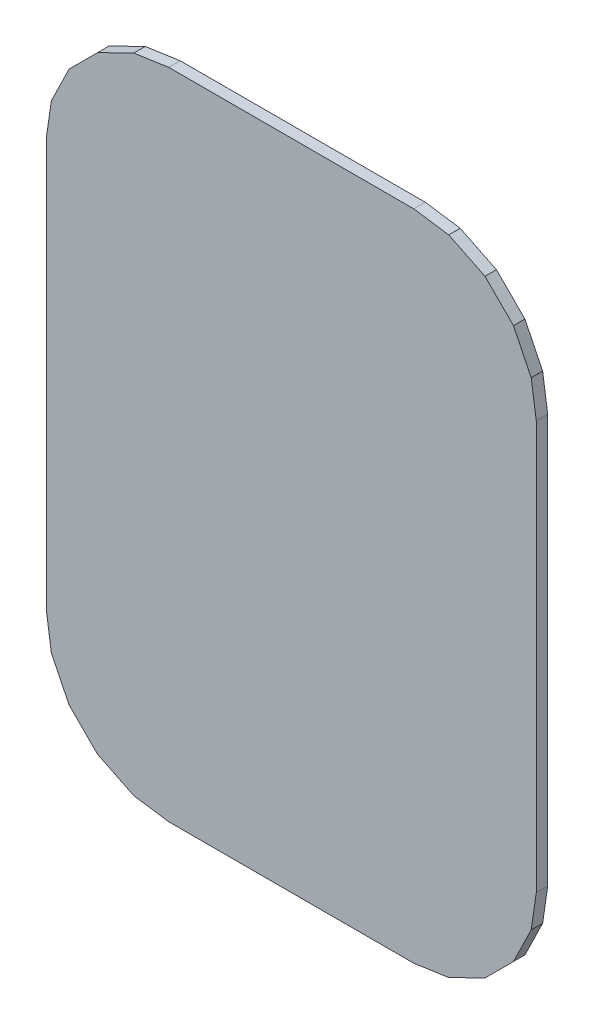
ISO-10303-21;
HEADER;
FILE_DESCRIPTION(('STEP AP214'),'2;1');
FILE_NAME('part.step','',(''),(''),'','','');
FILE_SCHEMA(('AUTOMOTIVE_DESIGN { 1 0 10303 214 1 1 1 1 }'));
ENDSEC;
DATA;
#1=APPLICATION_CONTEXT('core data for automotive mechanical design processes');
#2=APPLICATION_PROTOCOL_DEFINITION('international standard','automotive_design',2000,#1);
#3=PRODUCT_CONTEXT('',#1,'mechanical');
#4=PRODUCT('Part','Part','',(#3));
#5=PRODUCT_RELATED_PRODUCT_CATEGORY('part','',(#4));
#6=PRODUCT_DEFINITION_FORMATION('','',#4);
#7=PRODUCT_DEFINITION_CONTEXT('part definition',#1,'design');
#8=PRODUCT_DEFINITION('design','',#6,#7);
#9=PRODUCT_DEFINITION_SHAPE('','',#8);
#10=(LENGTH_UNIT() NAMED_UNIT(*) SI_UNIT(.MILLI.,.METRE.));
#11=(NAMED_UNIT(*) PLANE_ANGLE_UNIT() SI_UNIT($,.RADIAN.));
#12=(NAMED_UNIT(*) SI_UNIT($,.STERADIAN.) SOLID_ANGLE_UNIT());
#13=UNCERTAINTY_MEASURE_WITH_UNIT(LENGTH_MEASURE(1.E-05),#10,'distance_accuracy_value','');
#14=(GEOMETRIC_REPRESENTATION_CONTEXT(3) GLOBAL_UNCERTAINTY_ASSIGNED_CONTEXT((#13)) GLOBAL_UNIT_ASSIGNED_CONTEXT((#10,
#11,#12)) REPRESENTATION_CONTEXT('',''));
#15=CARTESIAN_POINT('',(0.,0.,0.));
#16=DIRECTION('',(0.,0.,1.));
#17=DIRECTION('',(1.,0.,0.));
#18=AXIS2_PLACEMENT_3D('',#15,#16,#17);
#19=CARTESIAN_POINT('',(109.1,-68.099999,1.635));
#20=DIRECTION('',(0.,0.,-1.));
#21=DIRECTION('',(0.,-1.,0.));
#22=AXIS2_PLACEMENT_3D('',#19,#20,#21);
#23=PLANE('',#22);
#24=DIRECTION('',(0.98955187352313,-0.144177285336019,0.));
#25=VECTOR('',#24,1.);
#26=CARTESIAN_POINT('',(109.475,-67.099999,1.635));
#27=LINE('',#26,#25);
#28=CARTESIAN_POINT('',(109.475,-67.099999,1.635));
#29=VERTEX_POINT('',#28);
#30=CARTESIAN_POINT('',(109.582001,-67.115589,1.635));
#31=VERTEX_POINT('',#30);
#32=EDGE_CURVE('E26',#29,#31,#27,.T.);
#33=ORIENTED_EDGE('',*,*,#32,.F.);
#34=DIRECTION('',(1.,0.,0.));
#35=VECTOR('',#34,1.);
#36=CARTESIAN_POINT('',(108.725,-67.099999,1.635));
#37=LINE('',#36,#35);
#38=CARTESIAN_POINT('',(108.725,-67.099999,1.635));
#39=VERTEX_POINT('',#38);
#40=EDGE_CURVE('E341',#39,#29,#37,.T.);
#41=ORIENTED_EDGE('',*,*,#40,.F.);
#42=DIRECTION('',(0.98955187352313,0.144177285336019,0.));
#43=VECTOR('',#42,1.);
#44=CARTESIAN_POINT('',(108.617999,-67.115589,1.635));
#45=LINE('',#44,#43);
#46=CARTESIAN_POINT('',(108.617999,-67.115589,1.635));
#47=VERTEX_POINT('',#46);
#48=EDGE_CURVE('E365',#47,#39,#45,.T.);
#49=ORIENTED_EDGE('',*,*,#48,.F.);
#50=DIRECTION('',(0.898391534871547,0.439195457707779,0.));
#51=VECTOR('',#50,1.);
#52=CARTESIAN_POINT('',(108.507096,-67.169806,1.635));
#53=LINE('',#52,#51);
#54=CARTESIAN_POINT('',(108.507096,-67.169806,1.635));
#55=VERTEX_POINT('',#54);
#56=EDGE_CURVE('E395',#55,#47,#53,.T.);
#57=ORIENTED_EDGE('',*,*,#56,.F.);
#58=DIRECTION('',(0.707106781186048,0.707106781187048,0.));
#59=VECTOR('',#58,1.);
#60=CARTESIAN_POINT('',(108.419807,-67.257095,1.635));
#61=LINE('',#60,#59);
#62=CARTESIAN_POINT('',(108.419807,-67.257095,1.635));
#63=VERTEX_POINT('',#62);
#64=EDGE_CURVE('E351',#63,#55,#61,.T.);
#65=ORIENTED_EDGE('',*,*,#64,.F.);
#66=DIRECTION('',(0.439195457707779,0.898391534871547,0.));
#67=VECTOR('',#66,1.);
#68=CARTESIAN_POINT('',(108.36559,-67.367998,1.635));
#69=LINE('',#68,#67);
#70=CARTESIAN_POINT('',(108.36559,-67.367998,1.635));
#71=VERTEX_POINT('',#70);
#72=EDGE_CURVE('E409',#71,#63,#69,.T.);
#73=ORIENTED_EDGE('',*,*,#72,.F.);
#74=DIRECTION('',(0.144177285336019,0.98955187352313,0.));
#75=VECTOR('',#74,1.);
#76=CARTESIAN_POINT('',(108.35,-67.474999,1.635));
#77=LINE('',#76,#75);
#78=CARTESIAN_POINT('',(108.35,-67.474999,1.635));
#79=VERTEX_POINT('',#78);
#80=EDGE_CURVE('E378',#79,#71,#77,.T.);
#81=ORIENTED_EDGE('',*,*,#80,.F.);
#82=DIRECTION('',(0.,1.,0.));
#83=VECTOR('',#82,1.);
#84=CARTESIAN_POINT('',(108.35,-68.724999,1.635));
#85=LINE('',#84,#83);
#86=CARTESIAN_POINT('',(108.35,-68.724999,1.635));
#87=VERTEX_POINT('',#86);
#88=EDGE_CURVE('E309',#87,#79,#85,.T.);
#89=ORIENTED_EDGE('',*,*,#88,.F.);
#90=DIRECTION('',(-0.144177285336019,0.98955187352313,0.));
#91=VECTOR('',#90,1.);
#92=CARTESIAN_POINT('',(108.36559,-68.832,1.635));
#93=LINE('',#92,#91);
#94=CARTESIAN_POINT('',(108.36559,-68.832,1.635));
#95=VERTEX_POINT('',#94);
#96=EDGE_CURVE('E404',#95,#87,#93,.T.);
#97=ORIENTED_EDGE('',*,*,#96,.F.);
#98=DIRECTION('',(-0.439195457707779,0.898391534871547,0.));
#99=VECTOR('',#98,1.);
#100=CARTESIAN_POINT('',(108.419807,-68.942903,1.635));
#101=LINE('',#100,#99);
#102=CARTESIAN_POINT('',(108.419807,-68.942903,1.635));
#103=VERTEX_POINT('',#102);
#104=EDGE_CURVE('E386',#103,#95,#101,.T.);
#105=ORIENTED_EDGE('',*,*,#104,.F.);
#106=DIRECTION('',(-0.707106781186548,0.707106781186548,0.));
#107=VECTOR('',#106,1.);
#108=CARTESIAN_POINT('',(108.507096,-69.030192,1.635));
#109=LINE('',#108,#107);
#110=CARTESIAN_POINT('',(108.507096,-69.030192,1.635));
#111=VERTEX_POINT('',#110);
#112=EDGE_CURVE('E301',#111,#103,#109,.T.);
#113=ORIENTED_EDGE('',*,*,#112,.F.);
#114=DIRECTION('',(-0.898391534871547,0.439195457707779,0.));
#115=VECTOR('',#114,1.);
#116=CARTESIAN_POINT('',(108.617999,-69.084409,1.635));
#117=LINE('',#116,#115);
#118=CARTESIAN_POINT('',(108.617999,-69.084409,1.635));
#119=VERTEX_POINT('',#118);
#120=EDGE_CURVE('E361',#119,#111,#117,.T.);
#121=ORIENTED_EDGE('',*,*,#120,.F.);
#122=DIRECTION('',(-0.98955187352313,0.144177285336019,0.));
#123=VECTOR('',#122,1.);
#124=CARTESIAN_POINT('',(108.725,-69.099999,1.635));
#125=LINE('',#124,#123);
#126=CARTESIAN_POINT('',(108.725,-69.099999,1.635));
#127=VERTEX_POINT('',#126);
#128=EDGE_CURVE('E340',#127,#119,#125,.T.);
#129=ORIENTED_EDGE('',*,*,#128,.F.);
#130=DIRECTION('',(-1.,0.,0.));
#131=VECTOR('',#130,1.);
#132=CARTESIAN_POINT('',(109.475,-69.099999,1.635));
#133=LINE('',#132,#131);
#134=CARTESIAN_POINT('',(109.475,-69.099999,1.635));
#135=VERTEX_POINT('',#134);
#136=EDGE_CURVE('E276',#135,#127,#133,.T.);
#137=ORIENTED_EDGE('',*,*,#136,.F.);
#138=DIRECTION('',(-0.98955187352313,-0.144177285336019,0.));
#139=VECTOR('',#138,1.);
#140=CARTESIAN_POINT('',(109.582001,-69.084409,1.635));
#141=LINE('',#140,#139);
#142=CARTESIAN_POINT('',(109.582001,-69.084409,1.635));
#143=VERTEX_POINT('',#142);
#144=EDGE_CURVE('E318',#143,#135,#141,.T.);
#145=ORIENTED_EDGE('',*,*,#144,.F.);
#146=DIRECTION('',(-0.898391534871547,-0.439195457707779,0.));
#147=VECTOR('',#146,1.);
#148=CARTESIAN_POINT('',(109.692904,-69.030192,1.635));
#149=LINE('',#148,#147);
#150=CARTESIAN_POINT('',(109.692904,-69.030192,1.635));
#151=VERTEX_POINT('',#150);
#152=EDGE_CURVE('E308',#151,#143,#149,.T.);
#153=ORIENTED_EDGE('',*,*,#152,.F.);
#154=DIRECTION('',(-0.707106781186548,-0.707106781186548,0.));
#155=VECTOR('',#154,1.);
#156=CARTESIAN_POINT('',(109.780193,-68.942903,1.635));
#157=LINE('',#156,#155);
#158=CARTESIAN_POINT('',(109.780193,-68.942903,1.635));
#159=VERTEX_POINT('',#158);
#160=EDGE_CURVE('E288',#159,#151,#157,.T.);
#161=ORIENTED_EDGE('',*,*,#160,.F.);
#162=DIRECTION('',(-0.439195457707779,-0.898391534871547,0.));
#163=VECTOR('',#162,1.);
#164=CARTESIAN_POINT('',(109.83441,-68.832,1.635));
#165=LINE('',#164,#163);
#166=CARTESIAN_POINT('',(109.83441,-68.832,1.635));
#167=VERTEX_POINT('',#166);
#168=EDGE_CURVE('E244',#167,#159,#165,.T.);
#169=ORIENTED_EDGE('',*,*,#168,.F.);
#170=DIRECTION('',(-0.144177285336019,-0.98955187352313,0.));
#171=VECTOR('',#170,1.);
#172=CARTESIAN_POINT('',(109.85,-68.724999,1.635));
#173=LINE('',#172,#171);
#174=CARTESIAN_POINT('',(109.85,-68.724999,1.635));
#175=VERTEX_POINT('',#174);
#176=EDGE_CURVE('E256',#175,#167,#173,.T.);
#177=ORIENTED_EDGE('',*,*,#176,.F.);
#178=DIRECTION('',(0.,-1.,0.));
#179=VECTOR('',#178,1.);
#180=CARTESIAN_POINT('',(109.85,-67.474999,1.635));
#181=LINE('',#180,#179);
#182=CARTESIAN_POINT('',(109.85,-67.474999,1.635));
#183=VERTEX_POINT('',#182);
#184=EDGE_CURVE('E259',#183,#175,#181,.T.);
#185=ORIENTED_EDGE('',*,*,#184,.F.);
#186=DIRECTION('',(0.144177285336019,-0.98955187352313,0.));
#187=VECTOR('',#186,1.);
#188=CARTESIAN_POINT('',(109.83441,-67.367998,1.635));
#189=LINE('',#188,#187);
#190=CARTESIAN_POINT('',(109.83441,-67.367998,1.635));
#191=VERTEX_POINT('',#190);
#192=EDGE_CURVE('E533',#191,#183,#189,.T.);
#193=ORIENTED_EDGE('',*,*,#192,.F.);
#194=DIRECTION('',(0.439195457707779,-0.898391534871547,0.));
#195=VECTOR('',#194,1.);
#196=CARTESIAN_POINT('',(109.780193,-67.257095,1.635));
#197=LINE('',#196,#195);
#198=CARTESIAN_POINT('',(109.780193,-67.257095,1.635));
#199=VERTEX_POINT('',#198);
#200=EDGE_CURVE('E520',#199,#191,#197,.T.);
#201=ORIENTED_EDGE('',*,*,#200,.F.);
#202=DIRECTION('',(0.707106781186048,-0.707106781187048,0.));
#203=VECTOR('',#202,1.);
#204=CARTESIAN_POINT('',(109.692904,-67.169806,1.635));
#205=LINE('',#204,#203);
#206=CARTESIAN_POINT('',(109.692904,-67.169806,1.635));
#207=VERTEX_POINT('',#206);
#208=EDGE_CURVE('E951',#207,#199,#205,.T.);
#209=ORIENTED_EDGE('',*,*,#208,.F.);
#210=DIRECTION('',(0.898391534871547,-0.439195457707779,0.));
#211=VECTOR('',#210,1.);
#212=CARTESIAN_POINT('',(109.582001,-67.115589,1.635));
#213=LINE('',#212,#211);
#214=EDGE_CURVE('E954',#31,#207,#213,.T.);
#215=ORIENTED_EDGE('',*,*,#214,.F.);
#216=EDGE_LOOP('',(#33,#41,#49,#57,#65,#73,#81,#89,#97,#105,#113,#121,#129,#137,#145,#153,#161,
#169,#177,#185,#193,#201,#209,#215));
#217=FACE_BOUND('',#216,.T.);
#218=ADVANCED_FACE('F17',(#217),#23,.F.);
#219=CARTESIAN_POINT('',(109.1,-68.099999,1.6));
#220=DIRECTION('',(0.,0.,-1.));
#221=DIRECTION('',(0.,-1.,0.));
#222=AXIS2_PLACEMENT_3D('',#219,#220,#221);
#223=PLANE('',#222);
#224=DIRECTION('',(0.898391534871547,-0.439195457707779,0.));
#225=VECTOR('',#224,1.);
#226=CARTESIAN_POINT('',(109.582001,-67.115589,1.6));
#227=LINE('',#226,#225);
#228=CARTESIAN_POINT('',(109.582001,-67.115589,1.6));
#229=VERTEX_POINT('',#228);
#230=CARTESIAN_POINT('',(109.692904,-67.169806,1.6));
#231=VERTEX_POINT('',#230);
#232=EDGE_CURVE('E957',#229,#231,#227,.T.);
#233=ORIENTED_EDGE('',*,*,#232,.T.);
#234=DIRECTION('',(0.707106781186048,-0.707106781187048,0.));
#235=VECTOR('',#234,1.);
#236=CARTESIAN_POINT('',(109.692904,-67.169806,1.6));
#237=LINE('',#236,#235);
#238=CARTESIAN_POINT('',(109.780193,-67.257095,1.6));
#239=VERTEX_POINT('',#238);
#240=EDGE_CURVE('E518',#231,#239,#237,.T.);
#241=ORIENTED_EDGE('',*,*,#240,.T.);
#242=DIRECTION('',(0.439195457707779,-0.898391534871547,0.));
#243=VECTOR('',#242,1.);
#244=CARTESIAN_POINT('',(109.780193,-67.257095,1.6));
#245=LINE('',#244,#243);
#246=CARTESIAN_POINT('',(109.83441,-67.367998,1.6));
#247=VERTEX_POINT('',#246);
#248=EDGE_CURVE('E530',#239,#247,#245,.T.);
#249=ORIENTED_EDGE('',*,*,#248,.T.);
#250=DIRECTION('',(0.144177285336019,-0.98955187352313,0.));
#251=VECTOR('',#250,1.);
#252=CARTESIAN_POINT('',(109.83441,-67.367998,1.6));
#253=LINE('',#252,#251);
#254=CARTESIAN_POINT('',(109.85,-67.474999,1.6));
#255=VERTEX_POINT('',#254);
#256=EDGE_CURVE('E251',#247,#255,#253,.T.);
#257=ORIENTED_EDGE('',*,*,#256,.T.);
#258=DIRECTION('',(0.,-1.,0.));
#259=VECTOR('',#258,1.);
#260=CARTESIAN_POINT('',(109.85,-67.474999,1.6));
#261=LINE('',#260,#259);
#262=CARTESIAN_POINT('',(109.85,-68.724999,1.6));
#263=VERTEX_POINT('',#262);
#264=EDGE_CURVE('E247',#255,#263,#261,.T.);
#265=ORIENTED_EDGE('',*,*,#264,.T.);
#266=DIRECTION('',(-0.144177285336019,-0.98955187352313,0.));
#267=VECTOR('',#266,1.);
#268=CARTESIAN_POINT('',(109.85,-68.724999,1.6));
#269=LINE('',#268,#267);
#270=CARTESIAN_POINT('',(109.83441,-68.832,1.6));
#271=VERTEX_POINT('',#270);
#272=EDGE_CURVE('E232',#263,#271,#269,.T.);
#273=ORIENTED_EDGE('',*,*,#272,.T.);
#274=DIRECTION('',(-0.439195457707779,-0.898391534871547,0.));
#275=VECTOR('',#274,1.);
#276=CARTESIAN_POINT('',(109.83441,-68.832,1.6));
#277=LINE('',#276,#275);
#278=CARTESIAN_POINT('',(109.780193,-68.942903,1.6));
#279=VERTEX_POINT('',#278);
#280=EDGE_CURVE('E285',#271,#279,#277,.T.);
#281=ORIENTED_EDGE('',*,*,#280,.T.);
#282=DIRECTION('',(-0.707106781186548,-0.707106781186548,0.));
#283=VECTOR('',#282,1.);
#284=CARTESIAN_POINT('',(109.780193,-68.942903,1.6));
#285=LINE('',#284,#283);
#286=CARTESIAN_POINT('',(109.692904,-69.030192,1.6));
#287=VERTEX_POINT('',#286);
#288=EDGE_CURVE('E296',#279,#287,#285,.T.);
#289=ORIENTED_EDGE('',*,*,#288,.T.);
#290=DIRECTION('',(-0.898391534871547,-0.439195457707779,0.));
#291=VECTOR('',#290,1.);
#292=CARTESIAN_POINT('',(109.692904,-69.030192,1.6));
#293=LINE('',#292,#291);
#294=CARTESIAN_POINT('',(109.582001,-69.084409,1.6));
#295=VERTEX_POINT('',#294);
#296=EDGE_CURVE('E307',#287,#295,#293,.T.);
#297=ORIENTED_EDGE('',*,*,#296,.T.);
#298=DIRECTION('',(-0.98955187352313,-0.144177285336019,0.));
#299=VECTOR('',#298,1.);
#300=CARTESIAN_POINT('',(109.582001,-69.084409,1.6));
#301=LINE('',#300,#299);
#302=CARTESIAN_POINT('',(109.475,-69.099999,1.6));
#303=VERTEX_POINT('',#302);
#304=EDGE_CURVE('E281',#295,#303,#301,.T.);
#305=ORIENTED_EDGE('',*,*,#304,.T.);
#306=DIRECTION('',(-1.,0.,0.));
#307=VECTOR('',#306,1.);
#308=CARTESIAN_POINT('',(109.475,-69.099999,1.6));
#309=LINE('',#308,#307);
#310=CARTESIAN_POINT('',(108.725,-69.099999,1.6));
#311=VERTEX_POINT('',#310);
#312=EDGE_CURVE('E336',#303,#311,#309,.T.);
#313=ORIENTED_EDGE('',*,*,#312,.T.);
#314=DIRECTION('',(-0.98955187352313,0.144177285336019,0.));
#315=VECTOR('',#314,1.);
#316=CARTESIAN_POINT('',(108.725,-69.099999,1.6));
#317=LINE('',#316,#315);
#318=CARTESIAN_POINT('',(108.617999,-69.084409,1.6));
#319=VERTEX_POINT('',#318);
#320=EDGE_CURVE('E360',#311,#319,#317,.T.);
#321=ORIENTED_EDGE('',*,*,#320,.T.);
#322=DIRECTION('',(-0.898391534871547,0.439195457707779,0.));
#323=VECTOR('',#322,1.);
#324=CARTESIAN_POINT('',(108.617999,-69.084409,1.6));
#325=LINE('',#324,#323);
#326=CARTESIAN_POINT('',(108.507096,-69.030192,1.6));
#327=VERTEX_POINT('',#326);
#328=EDGE_CURVE('E297',#319,#327,#325,.T.);
#329=ORIENTED_EDGE('',*,*,#328,.T.);
#330=DIRECTION('',(-0.707106781186548,0.707106781186548,0.));
#331=VECTOR('',#330,1.);
#332=CARTESIAN_POINT('',(108.507096,-69.030192,1.6));
#333=LINE('',#332,#331);
#334=CARTESIAN_POINT('',(108.419807,-68.942903,1.6));
#335=VERTEX_POINT('',#334);
#336=EDGE_CURVE('E269',#327,#335,#333,.T.);
#337=ORIENTED_EDGE('',*,*,#336,.T.);
#338=DIRECTION('',(-0.439195457707779,0.898391534871547,0.));
#339=VECTOR('',#338,1.);
#340=CARTESIAN_POINT('',(108.419807,-68.942903,1.6));
#341=LINE('',#340,#339);
#342=CARTESIAN_POINT('',(108.36559,-68.832,1.6));
#343=VERTEX_POINT('',#342);
#344=EDGE_CURVE('E394',#335,#343,#341,.T.);
#345=ORIENTED_EDGE('',*,*,#344,.T.);
#346=DIRECTION('',(-0.144177285336019,0.98955187352313,0.));
#347=VECTOR('',#346,1.);
#348=CARTESIAN_POINT('',(108.36559,-68.832,1.6));
#349=LINE('',#348,#347);
#350=CARTESIAN_POINT('',(108.35,-68.724999,1.6));
#351=VERTEX_POINT('',#350);
#352=EDGE_CURVE('E314',#343,#351,#349,.T.);
#353=ORIENTED_EDGE('',*,*,#352,.T.);
#354=DIRECTION('',(0.,1.,0.));
#355=VECTOR('',#354,1.);
#356=CARTESIAN_POINT('',(108.35,-68.724999,1.6));
#357=LINE('',#356,#355);
#358=CARTESIAN_POINT('',(108.35,-67.474999,1.6));
#359=VERTEX_POINT('',#358);
#360=EDGE_CURVE('E326',#351,#359,#357,.T.);
#361=ORIENTED_EDGE('',*,*,#360,.T.);
#362=DIRECTION('',(0.144177285336019,0.98955187352313,0.));
#363=VECTOR('',#362,1.);
#364=CARTESIAN_POINT('',(108.35,-67.474999,1.6));
#365=LINE('',#364,#363);
#366=CARTESIAN_POINT('',(108.36559,-67.367998,1.6));
#367=VERTEX_POINT('',#366);
#368=EDGE_CURVE('E414',#359,#367,#365,.T.);
#369=ORIENTED_EDGE('',*,*,#368,.T.);
#370=DIRECTION('',(0.439195457707779,0.898391534871547,0.));
#371=VECTOR('',#370,1.);
#372=CARTESIAN_POINT('',(108.36559,-67.367998,1.6));
#373=LINE('',#372,#371);
#374=CARTESIAN_POINT('',(108.419807,-67.257095,1.6));
#375=VERTEX_POINT('',#374);
#376=EDGE_CURVE('E356',#367,#375,#373,.T.);
#377=ORIENTED_EDGE('',*,*,#376,.T.);
#378=DIRECTION('',(0.707106781186048,0.707106781187048,0.));
#379=VECTOR('',#378,1.);
#380=CARTESIAN_POINT('',(108.419807,-67.257095,1.6));
#381=LINE('',#380,#379);
#382=CARTESIAN_POINT('',(108.507096,-67.169806,1.6));
#383=VERTEX_POINT('',#382);
#384=EDGE_CURVE('E400',#375,#383,#381,.T.);
#385=ORIENTED_EDGE('',*,*,#384,.T.);
#386=DIRECTION('',(0.898391534871547,0.439195457707779,0.));
#387=VECTOR('',#386,1.);
#388=CARTESIAN_POINT('',(108.507096,-67.169806,1.6));
#389=LINE('',#388,#387);
#390=CARTESIAN_POINT('',(108.617999,-67.115589,1.6));
#391=VERTEX_POINT('',#390);
#392=EDGE_CURVE('E370',#383,#391,#389,.T.);
#393=ORIENTED_EDGE('',*,*,#392,.T.);
#394=DIRECTION('',(0.98955187352313,0.144177285336019,0.));
#395=VECTOR('',#394,1.);
#396=CARTESIAN_POINT('',(108.617999,-67.115589,1.6));
#397=LINE('',#396,#395);
#398=CARTESIAN_POINT('',(108.725,-67.099999,1.6));
#399=VERTEX_POINT('',#398);
#400=EDGE_CURVE('E346',#391,#399,#397,.T.);
#401=ORIENTED_EDGE('',*,*,#400,.T.);
#402=DIRECTION('',(1.,0.,0.));
#403=VECTOR('',#402,1.);
#404=CARTESIAN_POINT('',(108.725,-67.099999,1.6));
#405=LINE('',#404,#403);
#406=CARTESIAN_POINT('',(109.475,-67.099999,1.6));
#407=VERTEX_POINT('',#406);
#408=EDGE_CURVE('E20',#399,#407,#405,.T.);
#409=ORIENTED_EDGE('',*,*,#408,.T.);
#410=DIRECTION('',(0.98955187352313,-0.144177285336019,0.));
#411=VECTOR('',#410,1.);
#412=CARTESIAN_POINT('',(109.475,-67.099999,1.6));
#413=LINE('',#412,#411);
#414=EDGE_CURVE('E11',#407,#229,#413,.T.);
#415=ORIENTED_EDGE('',*,*,#414,.T.);
#416=EDGE_LOOP('',(#233,#241,#249,#257,#265,#273,#281,#289,#297,#305,#313,#321,#329,#337,#345,
#353,#361,#369,#377,#385,#393,#401,#409,#415));
#417=FACE_BOUND('',#416,.T.);
#418=ADVANCED_FACE('F249',(#417),#223,.T.);
#419=CARTESIAN_POINT('',(109.475,-67.099999,1.6));
#420=DIRECTION('',(0.144177285336019,0.98955187352313,0.));
#421=DIRECTION('',(0.,0.,-1.));
#422=AXIS2_PLACEMENT_3D('',#419,#420,#421);
#423=PLANE('',#422);
#424=DIRECTION('',(0.,0.,1.));
#425=VECTOR('',#424,1.);
#426=CARTESIAN_POINT('',(109.475,-67.099999,1.6));
#427=LINE('',#426,#425);
#428=EDGE_CURVE('E345',#407,#29,#427,.T.);
#429=ORIENTED_EDGE('',*,*,#428,.T.);
#430=ORIENTED_EDGE('',*,*,#32,.T.);
#431=DIRECTION('',(0.,0.,1.));
#432=VECTOR('',#431,1.);
#433=CARTESIAN_POINT('',(109.582001,-67.115589,1.6));
#434=LINE('',#433,#432);
#435=EDGE_CURVE('E963',#229,#31,#434,.T.);
#436=ORIENTED_EDGE('',*,*,#435,.F.);
#437=ORIENTED_EDGE('',*,*,#414,.F.);
#438=EDGE_LOOP('',(#429,#430,#436,#437));
#439=FACE_BOUND('',#438,.T.);
#440=ADVANCED_FACE('F862',(#439),#423,.T.);
#441=CARTESIAN_POINT('',(108.725,-67.099999,1.6));
#442=DIRECTION('',(0.,1.,0.));
#443=DIRECTION('',(1.,0.,0.));
#444=AXIS2_PLACEMENT_3D('',#441,#442,#443);
#445=PLANE('',#444);
#446=DIRECTION('',(0.,0.,1.));
#447=VECTOR('',#446,1.);
#448=CARTESIAN_POINT('',(108.725,-67.099999,1.6));
#449=LINE('',#448,#447);
#450=EDGE_CURVE('E369',#399,#39,#449,.T.);
#451=ORIENTED_EDGE('',*,*,#450,.T.);
#452=ORIENTED_EDGE('',*,*,#40,.T.);
#453=ORIENTED_EDGE('',*,*,#428,.F.);
#454=ORIENTED_EDGE('',*,*,#408,.F.);
#455=EDGE_LOOP('',(#451,#452,#453,#454));
#456=FACE_BOUND('',#455,.T.);
#457=ADVANCED_FACE('F459',(#456),#445,.T.);
#458=CARTESIAN_POINT('',(108.617999,-67.115589,1.6));
#459=DIRECTION('',(-0.144177285336019,0.98955187352313,0.));
#460=DIRECTION('',(0.,0.,1.));
#461=AXIS2_PLACEMENT_3D('',#458,#459,#460);
#462=PLANE('',#461);
#463=DIRECTION('',(0.,0.,1.));
#464=VECTOR('',#463,1.);
#465=CARTESIAN_POINT('',(108.617999,-67.115589,1.6));
#466=LINE('',#465,#464);
#467=EDGE_CURVE('E399',#391,#47,#466,.T.);
#468=ORIENTED_EDGE('',*,*,#467,.T.);
#469=ORIENTED_EDGE('',*,*,#48,.T.);
#470=ORIENTED_EDGE('',*,*,#450,.F.);
#471=ORIENTED_EDGE('',*,*,#400,.F.);
#472=EDGE_LOOP('',(#468,#469,#470,#471));
#473=FACE_BOUND('',#472,.T.);
#474=ADVANCED_FACE('F462',(#473),#462,.T.);
#475=CARTESIAN_POINT('',(108.507096,-67.169806,1.6));
#476=DIRECTION('',(-0.439195457707779,0.898391534871547,0.));
#477=DIRECTION('',(0.,0.,1.));
#478=AXIS2_PLACEMENT_3D('',#475,#476,#477);
#479=PLANE('',#478);
#480=DIRECTION('',(0.,0.,1.));
#481=VECTOR('',#480,1.);
#482=CARTESIAN_POINT('',(108.507096,-67.169806,1.6));
#483=LINE('',#482,#481);
#484=EDGE_CURVE('E355',#383,#55,#483,.T.);
#485=ORIENTED_EDGE('',*,*,#484,.T.);
#486=ORIENTED_EDGE('',*,*,#56,.T.);
#487=ORIENTED_EDGE('',*,*,#467,.F.);
#488=ORIENTED_EDGE('',*,*,#392,.F.);
#489=EDGE_LOOP('',(#485,#486,#487,#488));
#490=FACE_BOUND('',#489,.T.);
#491=ADVANCED_FACE('F464',(#490),#479,.T.);
#492=CARTESIAN_POINT('',(108.419807,-67.257095,1.6));
#493=DIRECTION('',(-0.707106781187048,0.707106781186048,0.));
#494=DIRECTION('',(0.,0.,1.));
#495=AXIS2_PLACEMENT_3D('',#492,#493,#494);
#496=PLANE('',#495);
#497=DIRECTION('',(0.,0.,1.));
#498=VECTOR('',#497,1.);
#499=CARTESIAN_POINT('',(108.419807,-67.257095,1.6));
#500=LINE('',#499,#498);
#501=EDGE_CURVE('E413',#375,#63,#500,.T.);
#502=ORIENTED_EDGE('',*,*,#501,.T.);
#503=ORIENTED_EDGE('',*,*,#64,.T.);
#504=ORIENTED_EDGE('',*,*,#484,.F.);
#505=ORIENTED_EDGE('',*,*,#384,.F.);
#506=EDGE_LOOP('',(#502,#503,#504,#505));
#507=FACE_BOUND('',#506,.T.);
#508=ADVANCED_FACE('F467',(#507),#496,.T.);
#509=CARTESIAN_POINT('',(108.36559,-67.367998,1.6));
#510=DIRECTION('',(-0.898391534871547,0.439195457707779,0.));
#511=DIRECTION('',(0.,0.,1.));
#512=AXIS2_PLACEMENT_3D('',#509,#510,#511);
#513=PLANE('',#512);
#514=DIRECTION('',(0.,0.,1.));
#515=VECTOR('',#514,1.);
#516=CARTESIAN_POINT('',(108.36559,-67.367998,1.6));
#517=LINE('',#516,#515);
#518=EDGE_CURVE('E382',#367,#71,#517,.T.);
#519=ORIENTED_EDGE('',*,*,#518,.T.);
#520=ORIENTED_EDGE('',*,*,#72,.T.);
#521=ORIENTED_EDGE('',*,*,#501,.F.);
#522=ORIENTED_EDGE('',*,*,#376,.F.);
#523=EDGE_LOOP('',(#519,#520,#521,#522));
#524=FACE_BOUND('',#523,.T.);
#525=ADVANCED_FACE('F471',(#524),#513,.T.);
#526=CARTESIAN_POINT('',(108.35,-67.474999,1.6));
#527=DIRECTION('',(-0.98955187352313,0.144177285336019,0.));
#528=DIRECTION('',(0.,0.,1.));
#529=AXIS2_PLACEMENT_3D('',#526,#527,#528);
#530=PLANE('',#529);
#531=DIRECTION('',(0.,0.,1.));
#532=VECTOR('',#531,1.);
#533=CARTESIAN_POINT('',(108.35,-67.474999,1.6));
#534=LINE('',#533,#532);
#535=EDGE_CURVE('E313',#359,#79,#534,.T.);
#536=ORIENTED_EDGE('',*,*,#535,.T.);
#537=ORIENTED_EDGE('',*,*,#80,.T.);
#538=ORIENTED_EDGE('',*,*,#518,.F.);
#539=ORIENTED_EDGE('',*,*,#368,.F.);
#540=EDGE_LOOP('',(#536,#537,#538,#539));
#541=FACE_BOUND('',#540,.T.);
#542=ADVANCED_FACE('F474',(#541),#530,.T.);
#543=CARTESIAN_POINT('',(108.35,-68.724999,1.6));
#544=DIRECTION('',(-1.,0.,0.));
#545=DIRECTION('',(0.,0.,1.));
#546=AXIS2_PLACEMENT_3D('',#543,#544,#545);
#547=PLANE('',#546);
#548=DIRECTION('',(0.,0.,1.));
#549=VECTOR('',#548,1.);
#550=CARTESIAN_POINT('',(108.35,-68.724999,1.6));
#551=LINE('',#550,#549);
#552=EDGE_CURVE('E405',#351,#87,#551,.T.);
#553=ORIENTED_EDGE('',*,*,#552,.T.);
#554=ORIENTED_EDGE('',*,*,#88,.T.);
#555=ORIENTED_EDGE('',*,*,#535,.F.);
#556=ORIENTED_EDGE('',*,*,#360,.F.);
#557=EDGE_LOOP('',(#553,#554,#555,#556));
#558=FACE_BOUND('',#557,.T.);
#559=ADVANCED_FACE('F477',(#558),#547,.T.);
#560=CARTESIAN_POINT('',(108.36559,-68.832,1.6));
#561=DIRECTION('',(-0.98955187352313,-0.144177285336019,0.));
#562=DIRECTION('',(-0.144177285336019,0.98955187352313,0.));
#563=AXIS2_PLACEMENT_3D('',#560,#561,#562);
#564=PLANE('',#563);
#565=DIRECTION('',(0.,0.,1.));
#566=VECTOR('',#565,1.);
#567=CARTESIAN_POINT('',(108.36559,-68.832,1.6));
#568=LINE('',#567,#566);
#569=EDGE_CURVE('E390',#343,#95,#568,.T.);
#570=ORIENTED_EDGE('',*,*,#569,.T.);
#571=ORIENTED_EDGE('',*,*,#96,.T.);
#572=ORIENTED_EDGE('',*,*,#552,.F.);
#573=ORIENTED_EDGE('',*,*,#352,.F.);
#574=EDGE_LOOP('',(#570,#571,#572,#573));
#575=FACE_BOUND('',#574,.T.);
#576=ADVANCED_FACE('F484',(#575),#564,.T.);
#577=CARTESIAN_POINT('',(108.419807,-68.942903,1.6));
#578=DIRECTION('',(-0.898391534871547,-0.439195457707779,0.));
#579=DIRECTION('',(-0.439195457707779,0.898391534871547,0.));
#580=AXIS2_PLACEMENT_3D('',#577,#578,#579);
#581=PLANE('',#580);
#582=DIRECTION('',(0.,0.,1.));
#583=VECTOR('',#582,1.);
#584=CARTESIAN_POINT('',(108.419807,-68.942903,1.6));
#585=LINE('',#584,#583);
#586=EDGE_CURVE('E377',#335,#103,#585,.T.);
#587=ORIENTED_EDGE('',*,*,#586,.T.);
#588=ORIENTED_EDGE('',*,*,#104,.T.);
#589=ORIENTED_EDGE('',*,*,#569,.F.);
#590=ORIENTED_EDGE('',*,*,#344,.F.);
#591=EDGE_LOOP('',(#587,#588,#589,#590));
#592=FACE_BOUND('',#591,.T.);
#593=ADVANCED_FACE('F486',(#592),#581,.T.);
#594=CARTESIAN_POINT('',(108.507096,-69.030192,1.6));
#595=DIRECTION('',(-0.707106781186548,-0.707106781186548,0.));
#596=DIRECTION('',(-0.707106781186548,0.707106781186548,0.));
#597=AXIS2_PLACEMENT_3D('',#594,#595,#596);
#598=PLANE('',#597);
#599=DIRECTION('',(0.,0.,1.));
#600=VECTOR('',#599,1.);
#601=CARTESIAN_POINT('',(108.507096,-69.030192,1.6));
#602=LINE('',#601,#600);
#603=EDGE_CURVE('E302',#327,#111,#602,.T.);
#604=ORIENTED_EDGE('',*,*,#603,.T.);
#605=ORIENTED_EDGE('',*,*,#112,.T.);
#606=ORIENTED_EDGE('',*,*,#586,.F.);
#607=ORIENTED_EDGE('',*,*,#336,.F.);
#608=EDGE_LOOP('',(#604,#605,#606,#607));
#609=FACE_BOUND('',#608,.T.);
#610=ADVANCED_FACE('F490',(#609),#598,.T.);
#611=CARTESIAN_POINT('',(108.617999,-69.084409,1.6));
#612=DIRECTION('',(-0.439195457707779,-0.898391534871547,0.));
#613=DIRECTION('',(-0.898391534871547,0.439195457707779,0.));
#614=AXIS2_PLACEMENT_3D('',#611,#612,#613);
#615=PLANE('',#614);
#616=DIRECTION('',(0.,0.,1.));
#617=VECTOR('',#616,1.);
#618=CARTESIAN_POINT('',(108.617999,-69.084409,1.6));
#619=LINE('',#618,#617);
#620=EDGE_CURVE('E350',#319,#119,#619,.T.);
#621=ORIENTED_EDGE('',*,*,#620,.T.);
#622=ORIENTED_EDGE('',*,*,#120,.T.);
#623=ORIENTED_EDGE('',*,*,#603,.F.);
#624=ORIENTED_EDGE('',*,*,#328,.F.);
#625=EDGE_LOOP('',(#621,#622,#623,#624));
#626=FACE_BOUND('',#625,.T.);
#627=ADVANCED_FACE('F494',(#626),#615,.T.);
#628=CARTESIAN_POINT('',(108.725,-69.099999,1.6));
#629=DIRECTION('',(-0.144177285336019,-0.98955187352313,0.));
#630=DIRECTION('',(-0.98955187352313,0.144177285336019,0.));
#631=AXIS2_PLACEMENT_3D('',#628,#629,#630);
#632=PLANE('',#631);
#633=DIRECTION('',(0.,0.,1.));
#634=VECTOR('',#633,1.);
#635=CARTESIAN_POINT('',(108.725,-69.099999,1.6));
#636=LINE('',#635,#634);
#637=EDGE_CURVE('E280',#311,#127,#636,.T.);
#638=ORIENTED_EDGE('',*,*,#637,.T.);
#639=ORIENTED_EDGE('',*,*,#128,.T.);
#640=ORIENTED_EDGE('',*,*,#620,.F.);
#641=ORIENTED_EDGE('',*,*,#320,.F.);
#642=EDGE_LOOP('',(#638,#639,#640,#641));
#643=FACE_BOUND('',#642,.T.);
#644=ADVANCED_FACE('F497',(#643),#632,.T.);
#645=CARTESIAN_POINT('',(109.475,-69.099999,1.6));
#646=DIRECTION('',(0.,-1.,0.));
#647=DIRECTION('',(0.,0.,-1.));
#648=AXIS2_PLACEMENT_3D('',#645,#646,#647);
#649=PLANE('',#648);
#650=DIRECTION('',(0.,0.,1.));
#651=VECTOR('',#650,1.);
#652=CARTESIAN_POINT('',(109.475,-69.099999,1.6));
#653=LINE('',#652,#651);
#654=EDGE_CURVE('E321',#303,#135,#653,.T.);
#655=ORIENTED_EDGE('',*,*,#654,.T.);
#656=ORIENTED_EDGE('',*,*,#136,.T.);
#657=ORIENTED_EDGE('',*,*,#637,.F.);
#658=ORIENTED_EDGE('',*,*,#312,.F.);
#659=EDGE_LOOP('',(#655,#656,#657,#658));
#660=FACE_BOUND('',#659,.T.);
#661=ADVANCED_FACE('F500',(#660),#649,.T.);
#662=CARTESIAN_POINT('',(109.582001,-69.084409,1.6));
#663=DIRECTION('',(0.144177285336019,-0.98955187352313,0.));
#664=DIRECTION('',(0.,0.,-1.));
#665=AXIS2_PLACEMENT_3D('',#662,#663,#664);
#666=PLANE('',#665);
#667=DIRECTION('',(0.,0.,1.));
#668=VECTOR('',#667,1.);
#669=CARTESIAN_POINT('',(109.582001,-69.084409,1.6));
#670=LINE('',#669,#668);
#671=EDGE_CURVE('E303',#295,#143,#670,.T.);
#672=ORIENTED_EDGE('',*,*,#671,.T.);
#673=ORIENTED_EDGE('',*,*,#144,.T.);
#674=ORIENTED_EDGE('',*,*,#654,.F.);
#675=ORIENTED_EDGE('',*,*,#304,.F.);
#676=EDGE_LOOP('',(#672,#673,#674,#675));
#677=FACE_BOUND('',#676,.T.);
#678=ADVANCED_FACE('F505',(#677),#666,.T.);
#679=CARTESIAN_POINT('',(109.692904,-69.030192,1.6));
#680=DIRECTION('',(0.439195457707779,-0.898391534871547,0.));
#681=DIRECTION('',(0.,0.,-1.));
#682=AXIS2_PLACEMENT_3D('',#679,#680,#681);
#683=PLANE('',#682);
#684=DIRECTION('',(0.,0.,1.));
#685=VECTOR('',#684,1.);
#686=CARTESIAN_POINT('',(109.692904,-69.030192,1.6));
#687=LINE('',#686,#685);
#688=EDGE_CURVE('E292',#287,#151,#687,.T.);
#689=ORIENTED_EDGE('',*,*,#688,.T.);
#690=ORIENTED_EDGE('',*,*,#152,.T.);
#691=ORIENTED_EDGE('',*,*,#671,.F.);
#692=ORIENTED_EDGE('',*,*,#296,.F.);
#693=EDGE_LOOP('',(#689,#690,#691,#692));
#694=FACE_BOUND('',#693,.T.);
#695=ADVANCED_FACE('F507',(#694),#683,.T.);
#696=CARTESIAN_POINT('',(109.780193,-68.942903,1.6));
#697=DIRECTION('',(0.707106781186548,-0.707106781186548,0.));
#698=DIRECTION('',(0.,0.,-1.));
#699=AXIS2_PLACEMENT_3D('',#696,#697,#698);
#700=PLANE('',#699);
#701=DIRECTION('',(0.,0.,1.));
#702=VECTOR('',#701,1.);
#703=CARTESIAN_POINT('',(109.780193,-68.942903,1.6));
#704=LINE('',#703,#702);
#705=EDGE_CURVE('E275',#279,#159,#704,.T.);
#706=ORIENTED_EDGE('',*,*,#705,.T.);
#707=ORIENTED_EDGE('',*,*,#160,.T.);
#708=ORIENTED_EDGE('',*,*,#688,.F.);
#709=ORIENTED_EDGE('',*,*,#288,.F.);
#710=EDGE_LOOP('',(#706,#707,#708,#709));
#711=FACE_BOUND('',#710,.T.);
#712=ADVANCED_FACE('F734',(#711),#700,.T.);
#713=CARTESIAN_POINT('',(109.83441,-68.832,1.6));
#714=DIRECTION('',(0.898391534871547,-0.439195457707779,0.));
#715=DIRECTION('',(0.,0.,-1.));
#716=AXIS2_PLACEMENT_3D('',#713,#714,#715);
#717=PLANE('',#716);
#718=DIRECTION('',(0.,0.,1.));
#719=VECTOR('',#718,1.);
#720=CARTESIAN_POINT('',(109.83441,-68.832,1.6));
#721=LINE('',#720,#719);
#722=EDGE_CURVE('E240',#271,#167,#721,.T.);
#723=ORIENTED_EDGE('',*,*,#722,.T.);
#724=ORIENTED_EDGE('',*,*,#168,.T.);
#725=ORIENTED_EDGE('',*,*,#705,.F.);
#726=ORIENTED_EDGE('',*,*,#280,.F.);
#727=EDGE_LOOP('',(#723,#724,#725,#726));
#728=FACE_BOUND('',#727,.T.);
#729=ADVANCED_FACE('F724',(#728),#717,.T.);
#730=CARTESIAN_POINT('',(109.85,-68.724999,1.6));
#731=DIRECTION('',(0.98955187352313,-0.144177285336019,0.));
#732=DIRECTION('',(0.,0.,-1.));
#733=AXIS2_PLACEMENT_3D('',#730,#731,#732);
#734=PLANE('',#733);
#735=DIRECTION('',(0.,0.,1.));
#736=VECTOR('',#735,1.);
#737=CARTESIAN_POINT('',(109.85,-68.724999,1.6));
#738=LINE('',#737,#736);
#739=EDGE_CURVE('E237',#263,#175,#738,.T.);
#740=ORIENTED_EDGE('',*,*,#739,.T.);
#741=ORIENTED_EDGE('',*,*,#176,.T.);
#742=ORIENTED_EDGE('',*,*,#722,.F.);
#743=ORIENTED_EDGE('',*,*,#272,.F.);
#744=EDGE_LOOP('',(#740,#741,#742,#743));
#745=FACE_BOUND('',#744,.T.);
#746=ADVANCED_FACE('F234',(#745),#734,.T.);
#747=CARTESIAN_POINT('',(109.85,-67.474999,1.6));
#748=DIRECTION('',(1.,0.,0.));
#749=DIRECTION('',(0.,1.,0.));
#750=AXIS2_PLACEMENT_3D('',#747,#748,#749);
#751=PLANE('',#750);
#752=DIRECTION('',(0.,0.,1.));
#753=VECTOR('',#752,1.);
#754=CARTESIAN_POINT('',(109.85,-67.474999,1.6));
#755=LINE('',#754,#753);
#756=EDGE_CURVE('E537',#255,#183,#755,.T.);
#757=ORIENTED_EDGE('',*,*,#756,.T.);
#758=ORIENTED_EDGE('',*,*,#184,.T.);
#759=ORIENTED_EDGE('',*,*,#739,.F.);
#760=ORIENTED_EDGE('',*,*,#264,.F.);
#761=EDGE_LOOP('',(#757,#758,#759,#760));
#762=FACE_BOUND('',#761,.T.);
#763=ADVANCED_FACE('F258',(#762),#751,.T.);
#764=CARTESIAN_POINT('',(109.83441,-67.367998,1.6));
#765=DIRECTION('',(0.98955187352313,0.144177285336019,0.));
#766=DIRECTION('',(0.,0.,-1.));
#767=AXIS2_PLACEMENT_3D('',#764,#765,#766);
#768=PLANE('',#767);
#769=DIRECTION('',(0.,0.,1.));
#770=VECTOR('',#769,1.);
#771=CARTESIAN_POINT('',(109.83441,-67.367998,1.6));
#772=LINE('',#771,#770);
#773=EDGE_CURVE('E524',#247,#191,#772,.T.);
#774=ORIENTED_EDGE('',*,*,#773,.T.);
#775=ORIENTED_EDGE('',*,*,#192,.T.);
#776=ORIENTED_EDGE('',*,*,#756,.F.);
#777=ORIENTED_EDGE('',*,*,#256,.F.);
#778=EDGE_LOOP('',(#774,#775,#776,#777));
#779=FACE_BOUND('',#778,.T.);
#780=ADVANCED_FACE('F696',(#779),#768,.T.);
#781=CARTESIAN_POINT('',(109.780193,-67.257095,1.6));
#782=DIRECTION('',(0.898391534871547,0.439195457707779,0.));
#783=DIRECTION('',(0.,0.,-1.));
#784=AXIS2_PLACEMENT_3D('',#781,#782,#783);
#785=PLANE('',#784);
#786=DIRECTION('',(0.,0.,1.));
#787=VECTOR('',#786,1.);
#788=CARTESIAN_POINT('',(109.780193,-67.257095,1.6));
#789=LINE('',#788,#787);
#790=EDGE_CURVE('E949',#239,#199,#789,.T.);
#791=ORIENTED_EDGE('',*,*,#790,.T.);
#792=ORIENTED_EDGE('',*,*,#200,.T.);
#793=ORIENTED_EDGE('',*,*,#773,.F.);
#794=ORIENTED_EDGE('',*,*,#248,.F.);
#795=EDGE_LOOP('',(#791,#792,#793,#794));
#796=FACE_BOUND('',#795,.T.);
#797=ADVANCED_FACE('F686',(#796),#785,.T.);
#798=CARTESIAN_POINT('',(109.692904,-67.169806,1.6));
#799=DIRECTION('',(0.707106781187048,0.707106781186048,0.));
#800=DIRECTION('',(0.,0.,-1.));
#801=AXIS2_PLACEMENT_3D('',#798,#799,#800);
#802=PLANE('',#801);
#803=DIRECTION('',(0.,0.,1.));
#804=VECTOR('',#803,1.);
#805=CARTESIAN_POINT('',(109.692904,-67.169806,1.6));
#806=LINE('',#805,#804);
#807=EDGE_CURVE('E959',#231,#207,#806,.T.);
#808=ORIENTED_EDGE('',*,*,#807,.T.);
#809=ORIENTED_EDGE('',*,*,#208,.T.);
#810=ORIENTED_EDGE('',*,*,#790,.F.);
#811=ORIENTED_EDGE('',*,*,#240,.F.);
#812=EDGE_LOOP('',(#808,#809,#810,#811));
#813=FACE_BOUND('',#812,.T.);
#814=ADVANCED_FACE('F674',(#813),#802,.T.);
#815=CARTESIAN_POINT('',(109.582001,-67.115589,1.6));
#816=DIRECTION('',(0.439195457707779,0.898391534871547,0.));
#817=DIRECTION('',(0.,0.,-1.));
#818=AXIS2_PLACEMENT_3D('',#815,#816,#817);
#819=PLANE('',#818);
#820=ORIENTED_EDGE('',*,*,#435,.T.);
#821=ORIENTED_EDGE('',*,*,#214,.T.);
#822=ORIENTED_EDGE('',*,*,#807,.F.);
#823=ORIENTED_EDGE('',*,*,#232,.F.);
#824=EDGE_LOOP('',(#820,#821,#822,#823));
#825=FACE_BOUND('',#824,.T.);
#826=ADVANCED_FACE('F668',(#825),#819,.T.);
#827=CLOSED_SHELL('',(#218,#418,#440,#457,#474,#491,#508,#525,#542,#559,#576,#593,#610,#627,
#644,#661,#678,#695,#712,#729,#746,#763,#780,#797,#814,#826));
#828=MANIFOLD_SOLID_BREP('B1',#827);
#829=ADVANCED_BREP_SHAPE_REPRESENTATION('',(#18,#828),#14);
#830=SHAPE_DEFINITION_REPRESENTATION(#9,#829);
ENDSEC;
END-ISO-10303-21;
